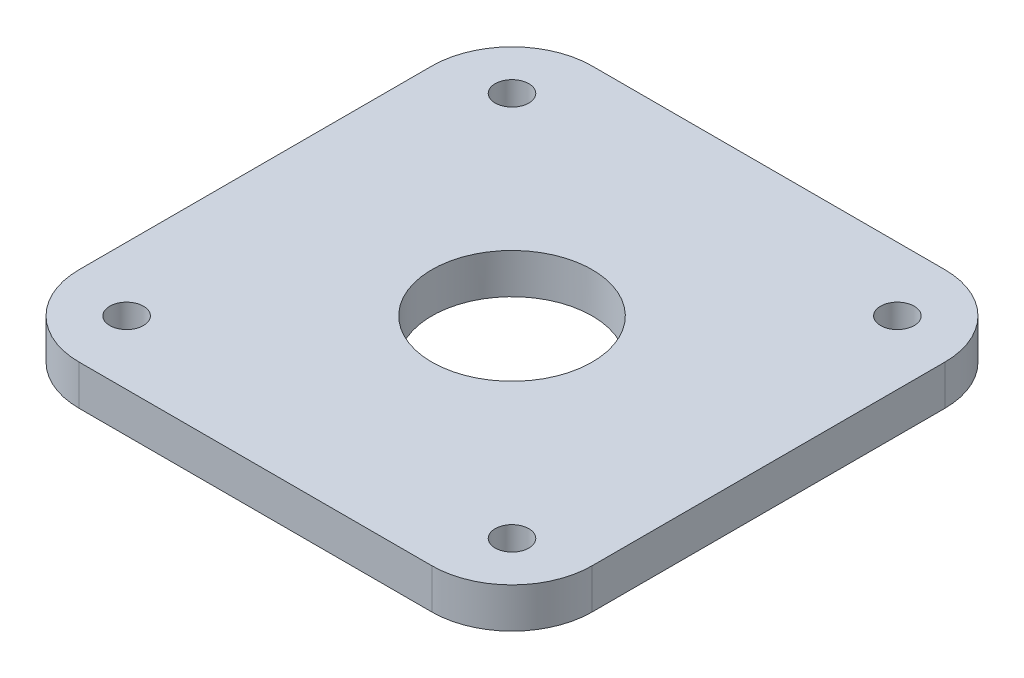
ISO-10303-21;
HEADER;
FILE_DESCRIPTION(('STEP AP214'),'2;1');
FILE_NAME('part.step','',(''),(''),'','','');
FILE_SCHEMA(('AUTOMOTIVE_DESIGN { 1 0 10303 214 1 1 1 1 }'));
ENDSEC;
DATA;
#1=APPLICATION_CONTEXT('core data for automotive mechanical design processes');
#2=APPLICATION_PROTOCOL_DEFINITION('international standard','automotive_design',2000,#1);
#3=PRODUCT_CONTEXT('',#1,'mechanical');
#4=PRODUCT('Part','Part','',(#3));
#5=PRODUCT_RELATED_PRODUCT_CATEGORY('part','',(#4));
#6=PRODUCT_DEFINITION_FORMATION('','',#4);
#7=PRODUCT_DEFINITION_CONTEXT('part definition',#1,'design');
#8=PRODUCT_DEFINITION('design','',#6,#7);
#9=PRODUCT_DEFINITION_SHAPE('','',#8);
#10=(LENGTH_UNIT() NAMED_UNIT(*) SI_UNIT(.MILLI.,.METRE.));
#11=(NAMED_UNIT(*) PLANE_ANGLE_UNIT() SI_UNIT($,.RADIAN.));
#12=(NAMED_UNIT(*) SI_UNIT($,.STERADIAN.) SOLID_ANGLE_UNIT());
#13=UNCERTAINTY_MEASURE_WITH_UNIT(LENGTH_MEASURE(1.E-05),#10,'distance_accuracy_value','');
#14=(GEOMETRIC_REPRESENTATION_CONTEXT(3) GLOBAL_UNCERTAINTY_ASSIGNED_CONTEXT((#13)) GLOBAL_UNIT_ASSIGNED_CONTEXT((#10,
#11,#12)) REPRESENTATION_CONTEXT('',''));
#15=CARTESIAN_POINT('',(0.,0.,0.));
#16=DIRECTION('',(0.,0.,1.));
#17=DIRECTION('',(1.,0.,0.));
#18=AXIS2_PLACEMENT_3D('',#15,#16,#17);
#19=CARTESIAN_POINT('',(32.,5.,32.));
#20=DIRECTION('',(-1.,0.,0.));
#21=DIRECTION('',(0.,0.,1.));
#22=AXIS2_PLACEMENT_3D('',#19,#20,#21);
#23=PLANE('',#22);
#24=DIRECTION('',(0.,0.,-1.));
#25=VECTOR('',#24,1.);
#26=CARTESIAN_POINT('',(32.,0.,32.));
#27=LINE('',#26,#25);
#28=CARTESIAN_POINT('',(32.,0.,22.));
#29=VERTEX_POINT('',#28);
#30=CARTESIAN_POINT('',(32.,0.,-22.));
#31=VERTEX_POINT('',#30);
#32=EDGE_CURVE('E136',#29,#31,#27,.T.);
#33=ORIENTED_EDGE('',*,*,#32,.T.);
#34=DIRECTION('',(0.,-1.,0.));
#35=VECTOR('',#34,1.);
#36=CARTESIAN_POINT('',(32.,5.,-22.));
#37=LINE('',#36,#35);
#38=CARTESIAN_POINT('',(32.,5.,-22.));
#39=VERTEX_POINT('',#38);
#40=EDGE_CURVE('E114',#31,#39,#37,.F.);
#41=ORIENTED_EDGE('',*,*,#40,.T.);
#42=DIRECTION('',(0.,0.,-1.));
#43=VECTOR('',#42,1.);
#44=CARTESIAN_POINT('',(32.,5.,32.));
#45=LINE('',#44,#43);
#46=CARTESIAN_POINT('',(32.,5.,22.));
#47=VERTEX_POINT('',#46);
#48=EDGE_CURVE('E146',#47,#39,#45,.T.);
#49=ORIENTED_EDGE('',*,*,#48,.F.);
#50=DIRECTION('',(0.,-1.,0.));
#51=VECTOR('',#50,1.);
#52=CARTESIAN_POINT('',(32.,5.,22.));
#53=LINE('',#52,#51);
#54=EDGE_CURVE('E119',#47,#29,#53,.T.);
#55=ORIENTED_EDGE('',*,*,#54,.T.);
#56=EDGE_LOOP('',(#33,#41,#49,#55));
#57=FACE_BOUND('',#56,.T.);
#58=ADVANCED_FACE('F41',(#57),#23,.F.);
#59=CARTESIAN_POINT('',(-32.,5.,-32.));
#60=DIRECTION('',(0.,0.,1.));
#61=DIRECTION('',(1.,0.,0.));
#62=AXIS2_PLACEMENT_3D('',#59,#60,#61);
#63=PLANE('',#62);
#64=DIRECTION('',(-1.,0.,0.));
#65=VECTOR('',#64,1.);
#66=CARTESIAN_POINT('',(-32.,5.,-32.));
#67=LINE('',#66,#65);
#68=CARTESIAN_POINT('',(22.,5.,-32.));
#69=VERTEX_POINT('',#68);
#70=CARTESIAN_POINT('',(-22.,5.,-32.));
#71=VERTEX_POINT('',#70);
#72=EDGE_CURVE('E129',#69,#71,#67,.T.);
#73=ORIENTED_EDGE('',*,*,#72,.F.);
#74=DIRECTION('',(0.,-1.,0.));
#75=VECTOR('',#74,1.);
#76=CARTESIAN_POINT('',(22.,5.,-32.));
#77=LINE('',#76,#75);
#78=CARTESIAN_POINT('',(22.,0.,-32.));
#79=VERTEX_POINT('',#78);
#80=EDGE_CURVE('E113',#69,#79,#77,.T.);
#81=ORIENTED_EDGE('',*,*,#80,.T.);
#82=DIRECTION('',(-1.,0.,0.));
#83=VECTOR('',#82,1.);
#84=CARTESIAN_POINT('',(-32.,0.,-32.));
#85=LINE('',#84,#83);
#86=CARTESIAN_POINT('',(-22.,0.,-32.));
#87=VERTEX_POINT('',#86);
#88=EDGE_CURVE('E126',#79,#87,#85,.T.);
#89=ORIENTED_EDGE('',*,*,#88,.T.);
#90=DIRECTION('',(0.,-1.,0.));
#91=VECTOR('',#90,1.);
#92=CARTESIAN_POINT('',(-22.,5.,-32.));
#93=LINE('',#92,#91);
#94=EDGE_CURVE('E131',#87,#71,#93,.F.);
#95=ORIENTED_EDGE('',*,*,#94,.T.);
#96=EDGE_LOOP('',(#73,#81,#89,#95));
#97=FACE_BOUND('',#96,.T.);
#98=ADVANCED_FACE('F125',(#97),#63,.F.);
#99=CARTESIAN_POINT('',(-32.,5.,32.));
#100=DIRECTION('',(1.,0.,0.));
#101=DIRECTION('',(0.,0.,-1.));
#102=AXIS2_PLACEMENT_3D('',#99,#100,#101);
#103=PLANE('',#102);
#104=DIRECTION('',(0.,0.,1.));
#105=VECTOR('',#104,1.);
#106=CARTESIAN_POINT('',(-32.,0.,32.));
#107=LINE('',#106,#105);
#108=CARTESIAN_POINT('',(-32.,0.,-22.));
#109=VERTEX_POINT('',#108);
#110=CARTESIAN_POINT('',(-32.,0.,22.));
#111=VERTEX_POINT('',#110);
#112=EDGE_CURVE('E135',#109,#111,#107,.T.);
#113=ORIENTED_EDGE('',*,*,#112,.T.);
#114=DIRECTION('',(0.,-1.,0.));
#115=VECTOR('',#114,1.);
#116=CARTESIAN_POINT('',(-32.,5.,22.));
#117=LINE('',#116,#115);
#118=CARTESIAN_POINT('',(-32.,5.,22.));
#119=VERTEX_POINT('',#118);
#120=EDGE_CURVE('E11',#111,#119,#117,.F.);
#121=ORIENTED_EDGE('',*,*,#120,.T.);
#122=DIRECTION('',(0.,0.,1.));
#123=VECTOR('',#122,1.);
#124=CARTESIAN_POINT('',(-32.,5.,32.));
#125=LINE('',#124,#123);
#126=CARTESIAN_POINT('',(-32.,5.,-22.));
#127=VERTEX_POINT('',#126);
#128=EDGE_CURVE('E215',#127,#119,#125,.T.);
#129=ORIENTED_EDGE('',*,*,#128,.F.);
#130=DIRECTION('',(0.,-1.,0.));
#131=VECTOR('',#130,1.);
#132=CARTESIAN_POINT('',(-32.,5.,-22.));
#133=LINE('',#132,#131);
#134=EDGE_CURVE('E50',#127,#109,#133,.T.);
#135=ORIENTED_EDGE('',*,*,#134,.T.);
#136=EDGE_LOOP('',(#113,#121,#129,#135));
#137=FACE_BOUND('',#136,.T.);
#138=ADVANCED_FACE('F229',(#137),#103,.F.);
#139=CARTESIAN_POINT('',(-32.,5.,32.));
#140=DIRECTION('',(0.,0.,-1.));
#141=DIRECTION('',(-1.,0.,0.));
#142=AXIS2_PLACEMENT_3D('',#139,#140,#141);
#143=PLANE('',#142);
#144=DIRECTION('',(1.,0.,0.));
#145=VECTOR('',#144,1.);
#146=CARTESIAN_POINT('',(-32.,0.,32.));
#147=LINE('',#146,#145);
#148=CARTESIAN_POINT('',(-22.,0.,32.));
#149=VERTEX_POINT('',#148);
#150=CARTESIAN_POINT('',(22.,0.,32.));
#151=VERTEX_POINT('',#150);
#152=EDGE_CURVE('E139',#149,#151,#147,.T.);
#153=ORIENTED_EDGE('',*,*,#152,.T.);
#154=DIRECTION('',(0.,-1.,0.));
#155=VECTOR('',#154,1.);
#156=CARTESIAN_POINT('',(22.,5.,32.));
#157=LINE('',#156,#155);
#158=CARTESIAN_POINT('',(22.,5.,32.));
#159=VERTEX_POINT('',#158);
#160=EDGE_CURVE('E58',#151,#159,#157,.F.);
#161=ORIENTED_EDGE('',*,*,#160,.T.);
#162=DIRECTION('',(1.,0.,0.));
#163=VECTOR('',#162,1.);
#164=CARTESIAN_POINT('',(-32.,5.,32.));
#165=LINE('',#164,#163);
#166=CARTESIAN_POINT('',(-22.,5.,32.));
#167=VERTEX_POINT('',#166);
#168=EDGE_CURVE('E147',#167,#159,#165,.T.);
#169=ORIENTED_EDGE('',*,*,#168,.F.);
#170=DIRECTION('',(0.,-1.,0.));
#171=VECTOR('',#170,1.);
#172=CARTESIAN_POINT('',(-22.,5.,32.));
#173=LINE('',#172,#171);
#174=EDGE_CURVE('E163',#167,#149,#173,.T.);
#175=ORIENTED_EDGE('',*,*,#174,.T.);
#176=EDGE_LOOP('',(#153,#161,#169,#175));
#177=FACE_BOUND('',#176,.T.);
#178=ADVANCED_FACE('F224',(#177),#143,.F.);
#179=CARTESIAN_POINT('',(0.,5.,0.));
#180=DIRECTION('',(0.,-1.,0.));
#181=DIRECTION('',(0.,0.,-1.));
#182=AXIS2_PLACEMENT_3D('',#179,#180,#181);
#183=PLANE('',#182);
#184=CARTESIAN_POINT('',(0.,5.,0.));
#185=DIRECTION('',(0.,1.,0.));
#186=DIRECTION('',(0.,0.,1.));
#187=AXIS2_PLACEMENT_3D('',#184,#185,#186);
#188=CIRCLE('',#187,10.);
#189=CARTESIAN_POINT('',(0.,5.,10.));
#190=VERTEX_POINT('',#189);
#191=EDGE_CURVE('E357',#190,#190,#188,.T.);
#192=ORIENTED_EDGE('',*,*,#191,.F.);
#193=EDGE_LOOP('',(#192));
#194=FACE_BOUND('',#193,.T.);
#195=CARTESIAN_POINT('',(-24.0416305603427,5.,-24.0416305603426));
#196=DIRECTION('',(0.,1.,0.));
#197=DIRECTION('',(0.,0.,1.));
#198=AXIS2_PLACEMENT_3D('',#195,#196,#197);
#199=CIRCLE('',#198,2.1);
#200=CARTESIAN_POINT('',(-24.0416305603427,5.,-21.9416305603426));
#201=VERTEX_POINT('',#200);
#202=EDGE_CURVE('E210',#201,#201,#199,.T.);
#203=ORIENTED_EDGE('',*,*,#202,.F.);
#204=EDGE_LOOP('',(#203));
#205=FACE_BOUND('',#204,.T.);
#206=CARTESIAN_POINT('',(-24.0416305603426,5.,24.0416305603427));
#207=DIRECTION('',(0.,1.,0.));
#208=DIRECTION('',(0.,0.,1.));
#209=AXIS2_PLACEMENT_3D('',#206,#207,#208);
#210=CIRCLE('',#209,2.1);
#211=CARTESIAN_POINT('',(-24.0416305603426,5.,26.1416305603427));
#212=VERTEX_POINT('',#211);
#213=EDGE_CURVE('E206',#212,#212,#210,.T.);
#214=ORIENTED_EDGE('',*,*,#213,.F.);
#215=EDGE_LOOP('',(#214));
#216=FACE_BOUND('',#215,.T.);
#217=CARTESIAN_POINT('',(24.0416305603427,5.,24.0416305603426));
#218=DIRECTION('',(0.,1.,0.));
#219=DIRECTION('',(0.,0.,1.));
#220=AXIS2_PLACEMENT_3D('',#217,#218,#219);
#221=CIRCLE('',#220,2.1);
#222=CARTESIAN_POINT('',(24.0416305603427,5.,26.1416305603426));
#223=VERTEX_POINT('',#222);
#224=EDGE_CURVE('E203',#223,#223,#221,.T.);
#225=ORIENTED_EDGE('',*,*,#224,.F.);
#226=EDGE_LOOP('',(#225));
#227=FACE_BOUND('',#226,.T.);
#228=CARTESIAN_POINT('',(24.0416305603426,5.,-24.0416305603427));
#229=DIRECTION('',(0.,1.,0.));
#230=DIRECTION('',(0.,0.,1.));
#231=AXIS2_PLACEMENT_3D('',#228,#229,#230);
#232=CIRCLE('',#231,2.1);
#233=CARTESIAN_POINT('',(24.0416305603426,5.,-21.9416305603427));
#234=VERTEX_POINT('',#233);
#235=EDGE_CURVE('E173',#234,#234,#232,.T.);
#236=ORIENTED_EDGE('',*,*,#235,.F.);
#237=EDGE_LOOP('',(#236));
#238=FACE_BOUND('',#237,.T.);
#239=ORIENTED_EDGE('',*,*,#48,.T.);
#240=CARTESIAN_POINT('',(22.,5.,-22.));
#241=DIRECTION('',(0.,-1.,0.));
#242=DIRECTION('',(0.,0.,-1.));
#243=AXIS2_PLACEMENT_3D('',#240,#241,#242);
#244=CIRCLE('',#243,10.);
#245=EDGE_CURVE('E161',#39,#69,#244,.F.);
#246=ORIENTED_EDGE('',*,*,#245,.T.);
#247=ORIENTED_EDGE('',*,*,#72,.T.);
#248=CARTESIAN_POINT('',(-22.,5.,-22.));
#249=DIRECTION('',(0.,-1.,0.));
#250=DIRECTION('',(0.,0.,-1.));
#251=AXIS2_PLACEMENT_3D('',#248,#249,#250);
#252=CIRCLE('',#251,10.);
#253=EDGE_CURVE('E156',#71,#127,#252,.F.);
#254=ORIENTED_EDGE('',*,*,#253,.T.);
#255=ORIENTED_EDGE('',*,*,#128,.T.);
#256=CARTESIAN_POINT('',(-22.,5.,22.));
#257=DIRECTION('',(0.,-1.,0.));
#258=DIRECTION('',(0.,0.,-1.));
#259=AXIS2_PLACEMENT_3D('',#256,#257,#258);
#260=CIRCLE('',#259,10.);
#261=EDGE_CURVE('E65',#119,#167,#260,.F.);
#262=ORIENTED_EDGE('',*,*,#261,.T.);
#263=ORIENTED_EDGE('',*,*,#168,.T.);
#264=CARTESIAN_POINT('',(22.,5.,22.));
#265=DIRECTION('',(0.,-1.,0.));
#266=DIRECTION('',(0.,0.,-1.));
#267=AXIS2_PLACEMENT_3D('',#264,#265,#266);
#268=CIRCLE('',#267,10.);
#269=EDGE_CURVE('E159',#159,#47,#268,.F.);
#270=ORIENTED_EDGE('',*,*,#269,.T.);
#271=EDGE_LOOP('',(#239,#246,#247,#254,#255,#262,#263,#270));
#272=FACE_BOUND('',#271,.T.);
#273=ADVANCED_FACE('F186',(#194,#205,#216,#227,#238,#272),#183,.F.);
#274=CARTESIAN_POINT('',(0.,0.,0.));
#275=DIRECTION('',(0.,-1.,0.));
#276=DIRECTION('',(0.,0.,-1.));
#277=AXIS2_PLACEMENT_3D('',#274,#275,#276);
#278=PLANE('',#277);
#279=CARTESIAN_POINT('',(0.,0.,0.));
#280=DIRECTION('',(0.,-1.,0.));
#281=DIRECTION('',(0.,0.,-1.));
#282=AXIS2_PLACEMENT_3D('',#279,#280,#281);
#283=CIRCLE('',#282,10.);
#284=CARTESIAN_POINT('',(0.,0.,-10.));
#285=VERTEX_POINT('',#284);
#286=EDGE_CURVE('E45',#285,#285,#283,.T.);
#287=ORIENTED_EDGE('',*,*,#286,.F.);
#288=EDGE_LOOP('',(#287));
#289=FACE_BOUND('',#288,.T.);
#290=CARTESIAN_POINT('',(-24.0416305603427,0.,-24.0416305603426));
#291=DIRECTION('',(0.,-1.,0.));
#292=DIRECTION('',(0.,0.,-1.));
#293=AXIS2_PLACEMENT_3D('',#290,#291,#292);
#294=CIRCLE('',#293,2.1);
#295=CARTESIAN_POINT('',(-24.0416305603427,0.,-26.1416305603426));
#296=VERTEX_POINT('',#295);
#297=EDGE_CURVE('E141',#296,#296,#294,.T.);
#298=ORIENTED_EDGE('',*,*,#297,.F.);
#299=EDGE_LOOP('',(#298));
#300=FACE_BOUND('',#299,.T.);
#301=CARTESIAN_POINT('',(-24.0416305603426,0.,24.0416305603427));
#302=DIRECTION('',(0.,-1.,0.));
#303=DIRECTION('',(0.,0.,-1.));
#304=AXIS2_PLACEMENT_3D('',#301,#302,#303);
#305=CIRCLE('',#304,2.1);
#306=CARTESIAN_POINT('',(-24.0416305603426,0.,21.9416305603427));
#307=VERTEX_POINT('',#306);
#308=EDGE_CURVE('E176',#307,#307,#305,.T.);
#309=ORIENTED_EDGE('',*,*,#308,.F.);
#310=EDGE_LOOP('',(#309));
#311=FACE_BOUND('',#310,.T.);
#312=CARTESIAN_POINT('',(24.0416305603427,0.,24.0416305603426));
#313=DIRECTION('',(0.,-1.,0.));
#314=DIRECTION('',(0.,0.,-1.));
#315=AXIS2_PLACEMENT_3D('',#312,#313,#314);
#316=CIRCLE('',#315,2.1);
#317=CARTESIAN_POINT('',(24.0416305603427,0.,21.9416305603426));
#318=VERTEX_POINT('',#317);
#319=EDGE_CURVE('E172',#318,#318,#316,.T.);
#320=ORIENTED_EDGE('',*,*,#319,.F.);
#321=EDGE_LOOP('',(#320));
#322=FACE_BOUND('',#321,.T.);
#323=CARTESIAN_POINT('',(24.0416305603426,0.,-24.0416305603427));
#324=DIRECTION('',(0.,-1.,0.));
#325=DIRECTION('',(0.,0.,-1.));
#326=AXIS2_PLACEMENT_3D('',#323,#324,#325);
#327=CIRCLE('',#326,2.1);
#328=CARTESIAN_POINT('',(24.0416305603426,0.,-26.1416305603427));
#329=VERTEX_POINT('',#328);
#330=EDGE_CURVE('E169',#329,#329,#327,.T.);
#331=ORIENTED_EDGE('',*,*,#330,.F.);
#332=EDGE_LOOP('',(#331));
#333=FACE_BOUND('',#332,.T.);
#334=ORIENTED_EDGE('',*,*,#88,.F.);
#335=CARTESIAN_POINT('',(22.,0.,-22.));
#336=DIRECTION('',(0.,-1.,0.));
#337=DIRECTION('',(0.,0.,-1.));
#338=AXIS2_PLACEMENT_3D('',#335,#336,#337);
#339=CIRCLE('',#338,10.);
#340=EDGE_CURVE('E109',#79,#31,#339,.T.);
#341=ORIENTED_EDGE('',*,*,#340,.T.);
#342=ORIENTED_EDGE('',*,*,#32,.F.);
#343=CARTESIAN_POINT('',(22.,0.,22.));
#344=DIRECTION('',(0.,-1.,0.));
#345=DIRECTION('',(0.,0.,-1.));
#346=AXIS2_PLACEMENT_3D('',#343,#344,#345);
#347=CIRCLE('',#346,10.);
#348=EDGE_CURVE('E120',#29,#151,#347,.T.);
#349=ORIENTED_EDGE('',*,*,#348,.T.);
#350=ORIENTED_EDGE('',*,*,#152,.F.);
#351=CARTESIAN_POINT('',(-22.,0.,22.));
#352=DIRECTION('',(0.,-1.,0.));
#353=DIRECTION('',(0.,0.,-1.));
#354=AXIS2_PLACEMENT_3D('',#351,#352,#353);
#355=CIRCLE('',#354,10.);
#356=EDGE_CURVE('E150',#149,#111,#355,.T.);
#357=ORIENTED_EDGE('',*,*,#356,.T.);
#358=ORIENTED_EDGE('',*,*,#112,.F.);
#359=CARTESIAN_POINT('',(-22.,0.,-22.));
#360=DIRECTION('',(0.,-1.,0.));
#361=DIRECTION('',(0.,0.,-1.));
#362=AXIS2_PLACEMENT_3D('',#359,#360,#361);
#363=CIRCLE('',#362,10.);
#364=EDGE_CURVE('E130',#109,#87,#363,.T.);
#365=ORIENTED_EDGE('',*,*,#364,.T.);
#366=EDGE_LOOP('',(#334,#341,#342,#349,#350,#357,#358,#365));
#367=FACE_BOUND('',#366,.T.);
#368=ADVANCED_FACE('F133',(#289,#300,#311,#322,#333,#367),#278,.T.);
#369=CARTESIAN_POINT('',(22.,5.,-22.));
#370=DIRECTION('',(0.,-1.,0.));
#371=DIRECTION('',(0.,0.,-1.));
#372=AXIS2_PLACEMENT_3D('',#369,#370,#371);
#373=CYLINDRICAL_SURFACE('',#372,10.);
#374=ORIENTED_EDGE('',*,*,#245,.F.);
#375=ORIENTED_EDGE('',*,*,#40,.F.);
#376=ORIENTED_EDGE('',*,*,#340,.F.);
#377=ORIENTED_EDGE('',*,*,#80,.F.);
#378=EDGE_LOOP('',(#374,#375,#376,#377));
#379=FACE_BOUND('',#378,.T.);
#380=ADVANCED_FACE('F112',(#379),#373,.T.);
#381=CARTESIAN_POINT('',(22.,5.,22.));
#382=DIRECTION('',(0.,-1.,0.));
#383=DIRECTION('',(0.,0.,-1.));
#384=AXIS2_PLACEMENT_3D('',#381,#382,#383);
#385=CYLINDRICAL_SURFACE('',#384,10.);
#386=ORIENTED_EDGE('',*,*,#269,.F.);
#387=ORIENTED_EDGE('',*,*,#160,.F.);
#388=ORIENTED_EDGE('',*,*,#348,.F.);
#389=ORIENTED_EDGE('',*,*,#54,.F.);
#390=EDGE_LOOP('',(#386,#387,#388,#389));
#391=FACE_BOUND('',#390,.T.);
#392=ADVANCED_FACE('F221',(#391),#385,.T.);
#393=CARTESIAN_POINT('',(-22.,5.,22.));
#394=DIRECTION('',(0.,-1.,0.));
#395=DIRECTION('',(0.,0.,-1.));
#396=AXIS2_PLACEMENT_3D('',#393,#394,#395);
#397=CYLINDRICAL_SURFACE('',#396,10.);
#398=ORIENTED_EDGE('',*,*,#261,.F.);
#399=ORIENTED_EDGE('',*,*,#120,.F.);
#400=ORIENTED_EDGE('',*,*,#356,.F.);
#401=ORIENTED_EDGE('',*,*,#174,.F.);
#402=EDGE_LOOP('',(#398,#399,#400,#401));
#403=FACE_BOUND('',#402,.T.);
#404=ADVANCED_FACE('F226',(#403),#397,.T.);
#405=CARTESIAN_POINT('',(-22.,5.,-22.));
#406=DIRECTION('',(0.,-1.,0.));
#407=DIRECTION('',(0.,0.,-1.));
#408=AXIS2_PLACEMENT_3D('',#405,#406,#407);
#409=CYLINDRICAL_SURFACE('',#408,10.);
#410=ORIENTED_EDGE('',*,*,#253,.F.);
#411=ORIENTED_EDGE('',*,*,#94,.F.);
#412=ORIENTED_EDGE('',*,*,#364,.F.);
#413=ORIENTED_EDGE('',*,*,#134,.F.);
#414=EDGE_LOOP('',(#410,#411,#412,#413));
#415=FACE_BOUND('',#414,.T.);
#416=ADVANCED_FACE('F43',(#415),#409,.T.);
#417=CARTESIAN_POINT('',(24.0416305603426,-5.,-24.0416305603427));
#418=DIRECTION('',(0.,1.,0.));
#419=DIRECTION('',(0.,0.,1.));
#420=AXIS2_PLACEMENT_3D('',#417,#418,#419);
#421=CYLINDRICAL_SURFACE('',#420,2.1);
#422=ORIENTED_EDGE('',*,*,#330,.T.);
#423=EDGE_LOOP('',(#422));
#424=FACE_BOUND('',#423,.T.);
#425=ORIENTED_EDGE('',*,*,#235,.T.);
#426=EDGE_LOOP('',(#425));
#427=FACE_BOUND('',#426,.T.);
#428=ADVANCED_FACE('F195',(#424,#427),#421,.F.);
#429=CARTESIAN_POINT('',(24.0416305603427,-5.,24.0416305603426));
#430=DIRECTION('',(0.,1.,0.));
#431=DIRECTION('',(0.,0.,1.));
#432=AXIS2_PLACEMENT_3D('',#429,#430,#431);
#433=CYLINDRICAL_SURFACE('',#432,2.1);
#434=ORIENTED_EDGE('',*,*,#319,.T.);
#435=EDGE_LOOP('',(#434));
#436=FACE_BOUND('',#435,.T.);
#437=ORIENTED_EDGE('',*,*,#224,.T.);
#438=EDGE_LOOP('',(#437));
#439=FACE_BOUND('',#438,.T.);
#440=ADVANCED_FACE('F198',(#436,#439),#433,.F.);
#441=CARTESIAN_POINT('',(-24.0416305603426,-5.,24.0416305603427));
#442=DIRECTION('',(0.,1.,0.));
#443=DIRECTION('',(0.,0.,1.));
#444=AXIS2_PLACEMENT_3D('',#441,#442,#443);
#445=CYLINDRICAL_SURFACE('',#444,2.1);
#446=ORIENTED_EDGE('',*,*,#308,.T.);
#447=EDGE_LOOP('',(#446));
#448=FACE_BOUND('',#447,.T.);
#449=ORIENTED_EDGE('',*,*,#213,.T.);
#450=EDGE_LOOP('',(#449));
#451=FACE_BOUND('',#450,.T.);
#452=ADVANCED_FACE('F279',(#448,#451),#445,.F.);
#453=CARTESIAN_POINT('',(-24.0416305603427,-5.,-24.0416305603426));
#454=DIRECTION('',(0.,1.,0.));
#455=DIRECTION('',(0.,0.,1.));
#456=AXIS2_PLACEMENT_3D('',#453,#454,#455);
#457=CYLINDRICAL_SURFACE('',#456,2.1);
#458=ORIENTED_EDGE('',*,*,#297,.T.);
#459=EDGE_LOOP('',(#458));
#460=FACE_BOUND('',#459,.T.);
#461=ORIENTED_EDGE('',*,*,#202,.T.);
#462=EDGE_LOOP('',(#461));
#463=FACE_BOUND('',#462,.T.);
#464=ADVANCED_FACE('F181',(#460,#463),#457,.F.);
#465=CARTESIAN_POINT('',(0.,-15.,0.));
#466=DIRECTION('',(0.,1.,0.));
#467=DIRECTION('',(0.,0.,1.));
#468=AXIS2_PLACEMENT_3D('',#465,#466,#467);
#469=CYLINDRICAL_SURFACE('',#468,10.);
#470=ORIENTED_EDGE('',*,*,#286,.T.);
#471=EDGE_LOOP('',(#470));
#472=FACE_BOUND('',#471,.T.);
#473=ORIENTED_EDGE('',*,*,#191,.T.);
#474=EDGE_LOOP('',(#473));
#475=FACE_BOUND('',#474,.T.);
#476=ADVANCED_FACE('F298',(#472,#475),#469,.F.);
#477=CLOSED_SHELL('',(#58,#98,#138,#178,#273,#368,#380,#392,#404,#416,#428,#440,#452,#464,#476));
#478=MANIFOLD_SOLID_BREP('B2',#477);
#479=ADVANCED_BREP_SHAPE_REPRESENTATION('',(#18,#478),#14);
#480=SHAPE_DEFINITION_REPRESENTATION(#9,#479);
ENDSEC;
END-ISO-10303-21;
